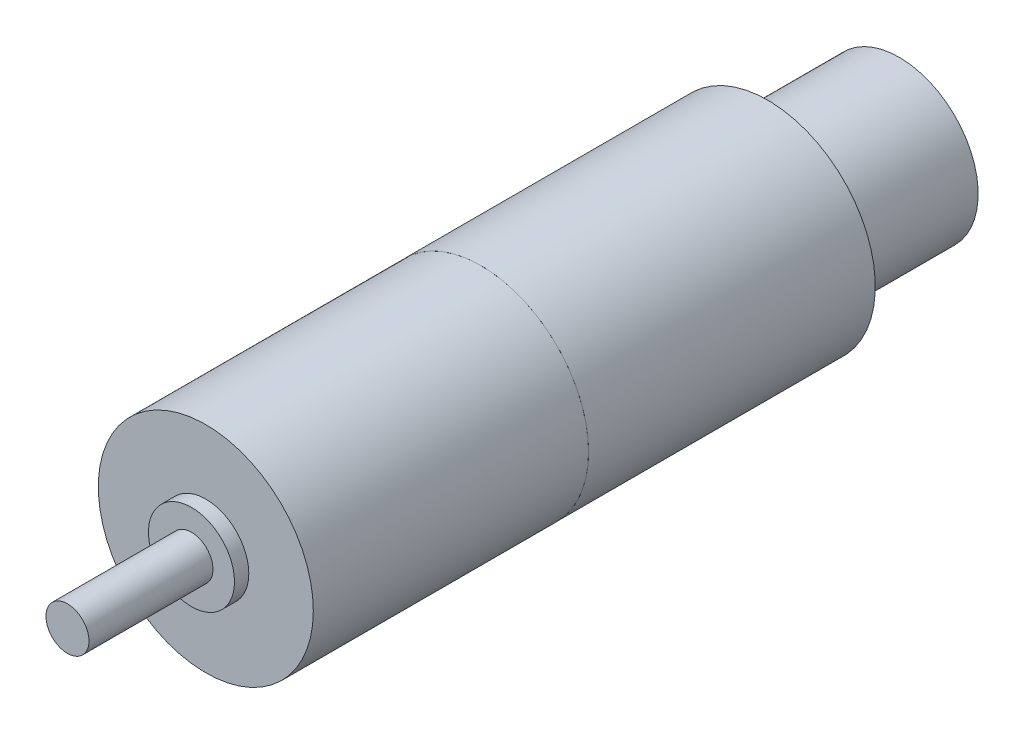
ISO-10303-21;
HEADER;
FILE_DESCRIPTION(('STEP AP214'),'2;1');
FILE_NAME('part.step','',(''),(''),'','','');
FILE_SCHEMA(('AUTOMOTIVE_DESIGN { 1 0 10303 214 1 1 1 1 }'));
ENDSEC;
DATA;
#1=APPLICATION_CONTEXT('core data for automotive mechanical design processes');
#2=APPLICATION_PROTOCOL_DEFINITION('international standard','automotive_design',2000,#1);
#3=PRODUCT_CONTEXT('',#1,'mechanical');
#4=PRODUCT('Part','Part','',(#3));
#5=PRODUCT_RELATED_PRODUCT_CATEGORY('part','',(#4));
#6=PRODUCT_DEFINITION_FORMATION('','',#4);
#7=PRODUCT_DEFINITION_CONTEXT('part definition',#1,'design');
#8=PRODUCT_DEFINITION('design','',#6,#7);
#9=PRODUCT_DEFINITION_SHAPE('','',#8);
#10=(LENGTH_UNIT() NAMED_UNIT(*) SI_UNIT(.MILLI.,.METRE.));
#11=(NAMED_UNIT(*) PLANE_ANGLE_UNIT() SI_UNIT($,.RADIAN.));
#12=(NAMED_UNIT(*) SI_UNIT($,.STERADIAN.) SOLID_ANGLE_UNIT());
#13=UNCERTAINTY_MEASURE_WITH_UNIT(LENGTH_MEASURE(1.E-05),#10,'distance_accuracy_value','');
#14=(GEOMETRIC_REPRESENTATION_CONTEXT(3) GLOBAL_UNCERTAINTY_ASSIGNED_CONTEXT((#13)) GLOBAL_UNIT_ASSIGNED_CONTEXT((#10,
#11,#12)) REPRESENTATION_CONTEXT('',''));
#15=CARTESIAN_POINT('',(0.,0.,0.));
#16=DIRECTION('',(0.,0.,1.));
#17=DIRECTION('',(1.,0.,0.));
#18=AXIS2_PLACEMENT_3D('',#15,#16,#17);
#19=CARTESIAN_POINT('',(0.,0.,57.7));
#20=DIRECTION('',(0.,0.,-1.));
#21=DIRECTION('',(-1.,0.,0.));
#22=AXIS2_PLACEMENT_3D('',#19,#20,#21);
#23=CYLINDRICAL_SURFACE('',#22,3.);
#24=CARTESIAN_POINT('',(0.,0.,57.7));
#25=DIRECTION('',(0.,0.,1.));
#26=DIRECTION('',(1.,0.,0.));
#27=AXIS2_PLACEMENT_3D('',#24,#25,#26);
#28=CIRCLE('',#27,3.);
#29=CARTESIAN_POINT('',(3.,0.,57.7));
#30=VERTEX_POINT('',#29);
#31=EDGE_CURVE('E11',#30,#30,#28,.T.);
#32=ORIENTED_EDGE('',*,*,#31,.F.);
#33=EDGE_LOOP('',(#32));
#34=FACE_BOUND('',#33,.T.);
#35=CARTESIAN_POINT('',(0.,0.,40.4));
#36=DIRECTION('',(0.,0.,1.));
#37=DIRECTION('',(1.,0.,0.));
#38=AXIS2_PLACEMENT_3D('',#35,#36,#37);
#39=CIRCLE('',#38,3.);
#40=CARTESIAN_POINT('',(3.,0.,40.4));
#41=VERTEX_POINT('',#40);
#42=EDGE_CURVE('E49',#41,#41,#39,.T.);
#43=ORIENTED_EDGE('',*,*,#42,.T.);
#44=EDGE_LOOP('',(#43));
#45=FACE_BOUND('',#44,.T.);
#46=ADVANCED_FACE('F46',(#34,#45),#23,.T.);
#47=CARTESIAN_POINT('',(0.,0.,57.7));
#48=DIRECTION('',(0.,0.,1.));
#49=DIRECTION('',(1.,0.,0.));
#50=AXIS2_PLACEMENT_3D('',#47,#48,#49);
#51=PLANE('',#50);
#52=ORIENTED_EDGE('',*,*,#31,.T.);
#53=EDGE_LOOP('',(#52));
#54=FACE_BOUND('',#53,.T.);
#55=ADVANCED_FACE('F61',(#54),#51,.T.);
#56=CARTESIAN_POINT('',(0.,0.,40.4));
#57=DIRECTION('',(0.,0.,1.));
#58=DIRECTION('',(1.,0.,0.));
#59=AXIS2_PLACEMENT_3D('',#56,#57,#58);
#60=PLANE('',#59);
#61=ORIENTED_EDGE('',*,*,#42,.F.);
#62=EDGE_LOOP('',(#61));
#63=FACE_BOUND('',#62,.T.);
#64=ADVANCED_FACE('F59',(#63),#60,.F.);
#65=CLOSED_SHELL('',(#46,#55,#64));
#66=MANIFOLD_SOLID_BREP('B2',#65);
#67=CARTESIAN_POINT('',(0.,0.,-58.35));
#68=DIRECTION('',(0.,0.,1.));
#69=DIRECTION('',(1.,0.,0.));
#70=AXIS2_PLACEMENT_3D('',#67,#68,#69);
#71=CYLINDRICAL_SURFACE('',#70,11.);
#72=CARTESIAN_POINT('',(0.,0.,-58.35));
#73=DIRECTION('',(0.,0.,-1.));
#74=DIRECTION('',(-1.,0.,0.));
#75=AXIS2_PLACEMENT_3D('',#72,#73,#74);
#76=CIRCLE('',#75,11.);
#77=CARTESIAN_POINT('',(-11.,0.,-58.35));
#78=VERTEX_POINT('',#77);
#79=EDGE_CURVE('E45',#78,#78,#76,.T.);
#80=ORIENTED_EDGE('',*,*,#79,.F.);
#81=EDGE_LOOP('',(#80));
#82=FACE_BOUND('',#81,.T.);
#83=CARTESIAN_POINT('',(0.,0.,-40.));
#84=DIRECTION('',(0.,0.,-1.));
#85=DIRECTION('',(-1.,0.,0.));
#86=AXIS2_PLACEMENT_3D('',#83,#84,#85);
#87=CIRCLE('',#86,11.);
#88=CARTESIAN_POINT('',(-11.,0.,-40.));
#89=VERTEX_POINT('',#88);
#90=EDGE_CURVE('E98',#89,#89,#87,.T.);
#91=ORIENTED_EDGE('',*,*,#90,.T.);
#92=EDGE_LOOP('',(#91));
#93=FACE_BOUND('',#92,.T.);
#94=ADVANCED_FACE('F95',(#82,#93),#71,.T.);
#95=CARTESIAN_POINT('',(0.,0.,-58.35));
#96=DIRECTION('',(0.,0.,-1.));
#97=DIRECTION('',(-1.,0.,0.));
#98=AXIS2_PLACEMENT_3D('',#95,#96,#97);
#99=PLANE('',#98);
#100=ORIENTED_EDGE('',*,*,#79,.T.);
#101=EDGE_LOOP('',(#100));
#102=FACE_BOUND('',#101,.T.);
#103=ADVANCED_FACE('F110',(#102),#99,.T.);
#104=CARTESIAN_POINT('',(0.,0.,-40.));
#105=DIRECTION('',(0.,0.,-1.));
#106=DIRECTION('',(-1.,0.,0.));
#107=AXIS2_PLACEMENT_3D('',#104,#105,#106);
#108=PLANE('',#107);
#109=ORIENTED_EDGE('',*,*,#90,.F.);
#110=EDGE_LOOP('',(#109));
#111=FACE_BOUND('',#110,.T.);
#112=ADVANCED_FACE('F108',(#111),#108,.F.);
#113=CLOSED_SHELL('',(#94,#103,#112));
#114=MANIFOLD_SOLID_BREP('B6',#113);
#115=CARTESIAN_POINT('',(0.,0.,-40.));
#116=DIRECTION('',(0.,0.,1.));
#117=DIRECTION('',(1.,0.,0.));
#118=AXIS2_PLACEMENT_3D('',#115,#116,#117);
#119=CYLINDRICAL_SURFACE('',#118,15.);
#120=CARTESIAN_POINT('',(0.,0.,-40.));
#121=DIRECTION('',(0.,0.,-1.));
#122=DIRECTION('',(-1.,0.,0.));
#123=AXIS2_PLACEMENT_3D('',#120,#121,#122);
#124=CIRCLE('',#123,15.);
#125=CARTESIAN_POINT('',(-15.,0.,-40.));
#126=VERTEX_POINT('',#125);
#127=EDGE_CURVE('E94',#126,#126,#124,.T.);
#128=ORIENTED_EDGE('',*,*,#127,.F.);
#129=EDGE_LOOP('',(#128));
#130=FACE_BOUND('',#129,.T.);
#131=CARTESIAN_POINT('',(0.,0.,0.));
#132=DIRECTION('',(0.,0.,-1.));
#133=DIRECTION('',(-1.,0.,0.));
#134=AXIS2_PLACEMENT_3D('',#131,#132,#133);
#135=CIRCLE('',#134,15.);
#136=CARTESIAN_POINT('',(-15.,0.,0.));
#137=VERTEX_POINT('',#136);
#138=EDGE_CURVE('E146',#137,#137,#135,.T.);
#139=ORIENTED_EDGE('',*,*,#138,.T.);
#140=EDGE_LOOP('',(#139));
#141=FACE_BOUND('',#140,.T.);
#142=ADVANCED_FACE('F143',(#130,#141),#119,.T.);
#143=CARTESIAN_POINT('',(0.,0.,-40.));
#144=DIRECTION('',(0.,0.,-1.));
#145=DIRECTION('',(-1.,0.,0.));
#146=AXIS2_PLACEMENT_3D('',#143,#144,#145);
#147=PLANE('',#146);
#148=ORIENTED_EDGE('',*,*,#127,.T.);
#149=EDGE_LOOP('',(#148));
#150=FACE_BOUND('',#149,.T.);
#151=ADVANCED_FACE('F158',(#150),#147,.T.);
#152=CARTESIAN_POINT('',(0.,0.,0.));
#153=DIRECTION('',(0.,0.,-1.));
#154=DIRECTION('',(-1.,0.,0.));
#155=AXIS2_PLACEMENT_3D('',#152,#153,#154);
#156=PLANE('',#155);
#157=ORIENTED_EDGE('',*,*,#138,.F.);
#158=EDGE_LOOP('',(#157));
#159=FACE_BOUND('',#158,.T.);
#160=ADVANCED_FACE('F156',(#159),#156,.F.);
#161=CLOSED_SHELL('',(#142,#151,#160));
#162=MANIFOLD_SOLID_BREP('B40',#161);
#163=CARTESIAN_POINT('',(0.,0.,38.4));
#164=DIRECTION('',(0.,0.,-1.));
#165=DIRECTION('',(-1.,0.,0.));
#166=AXIS2_PLACEMENT_3D('',#163,#164,#165);
#167=CYLINDRICAL_SURFACE('',#166,15.);
#168=CARTESIAN_POINT('',(0.,0.,38.4));
#169=DIRECTION('',(0.,0.,1.));
#170=DIRECTION('',(1.,0.,0.));
#171=AXIS2_PLACEMENT_3D('',#168,#169,#170);
#172=CIRCLE('',#171,15.);
#173=CARTESIAN_POINT('',(15.,0.,38.4));
#174=VERTEX_POINT('',#173);
#175=EDGE_CURVE('E191',#174,#174,#172,.T.);
#176=ORIENTED_EDGE('',*,*,#175,.F.);
#177=EDGE_LOOP('',(#176));
#178=FACE_BOUND('',#177,.T.);
#179=CARTESIAN_POINT('',(0.,0.,0.));
#180=DIRECTION('',(0.,0.,1.));
#181=DIRECTION('',(1.,0.,0.));
#182=AXIS2_PLACEMENT_3D('',#179,#180,#181);
#183=CIRCLE('',#182,15.);
#184=CARTESIAN_POINT('',(15.,0.,0.));
#185=VERTEX_POINT('',#184);
#186=EDGE_CURVE('E187',#185,#185,#183,.T.);
#187=ORIENTED_EDGE('',*,*,#186,.T.);
#188=EDGE_LOOP('',(#187));
#189=FACE_BOUND('',#188,.T.);
#190=ADVANCED_FACE('F184',(#178,#189),#167,.T.);
#191=CARTESIAN_POINT('',(0.,0.,38.4));
#192=DIRECTION('',(0.,0.,1.));
#193=DIRECTION('',(1.,0.,0.));
#194=AXIS2_PLACEMENT_3D('',#191,#192,#193);
#195=PLANE('',#194);
#196=CARTESIAN_POINT('',(0.,0.,38.4));
#197=DIRECTION('',(0.,0.,1.));
#198=DIRECTION('',(1.,0.,0.));
#199=AXIS2_PLACEMENT_3D('',#196,#197,#198);
#200=CIRCLE('',#199,6.);
#201=CARTESIAN_POINT('',(6.,0.,38.4));
#202=VERTEX_POINT('',#201);
#203=EDGE_CURVE('E142',#202,#202,#200,.T.);
#204=ORIENTED_EDGE('',*,*,#203,.F.);
#205=EDGE_LOOP('',(#204));
#206=FACE_BOUND('',#205,.T.);
#207=ORIENTED_EDGE('',*,*,#175,.T.);
#208=EDGE_LOOP('',(#207));
#209=FACE_BOUND('',#208,.T.);
#210=ADVANCED_FACE('F208',(#206,#209),#195,.T.);
#211=CARTESIAN_POINT('',(0.,0.,0.));
#212=DIRECTION('',(0.,0.,1.));
#213=DIRECTION('',(1.,0.,0.));
#214=AXIS2_PLACEMENT_3D('',#211,#212,#213);
#215=PLANE('',#214);
#216=ORIENTED_EDGE('',*,*,#186,.F.);
#217=EDGE_LOOP('',(#216));
#218=FACE_BOUND('',#217,.T.);
#219=ADVANCED_FACE('F205',(#218),#215,.F.);
#220=CARTESIAN_POINT('',(0.,0.,40.4));
#221=DIRECTION('',(0.,0.,-1.));
#222=DIRECTION('',(-1.,0.,0.));
#223=AXIS2_PLACEMENT_3D('',#220,#221,#222);
#224=CYLINDRICAL_SURFACE('',#223,6.);
#225=CARTESIAN_POINT('',(0.,0.,40.4));
#226=DIRECTION('',(0.,0.,1.));
#227=DIRECTION('',(1.,0.,0.));
#228=AXIS2_PLACEMENT_3D('',#225,#226,#227);
#229=CIRCLE('',#228,6.);
#230=CARTESIAN_POINT('',(6.,0.,40.4));
#231=VERTEX_POINT('',#230);
#232=EDGE_CURVE('E197',#231,#231,#229,.T.);
#233=ORIENTED_EDGE('',*,*,#232,.F.);
#234=EDGE_LOOP('',(#233));
#235=FACE_BOUND('',#234,.T.);
#236=ORIENTED_EDGE('',*,*,#203,.T.);
#237=EDGE_LOOP('',(#236));
#238=FACE_BOUND('',#237,.T.);
#239=ADVANCED_FACE('F207',(#235,#238),#224,.T.);
#240=CARTESIAN_POINT('',(0.,0.,40.4));
#241=DIRECTION('',(0.,0.,1.));
#242=DIRECTION('',(1.,0.,0.));
#243=AXIS2_PLACEMENT_3D('',#240,#241,#242);
#244=PLANE('',#243);
#245=ORIENTED_EDGE('',*,*,#232,.T.);
#246=EDGE_LOOP('',(#245));
#247=FACE_BOUND('',#246,.T.);
#248=ADVANCED_FACE('F213',(#247),#244,.T.);
#249=CLOSED_SHELL('',(#190,#210,#219,#239,#248));
#250=MANIFOLD_SOLID_BREP('B89',#249);
#251=ADVANCED_BREP_SHAPE_REPRESENTATION('',(#18,#66,#114,#162,#250),#14);
#252=SHAPE_DEFINITION_REPRESENTATION(#9,#251);
ENDSEC;
END-ISO-10303-21;
